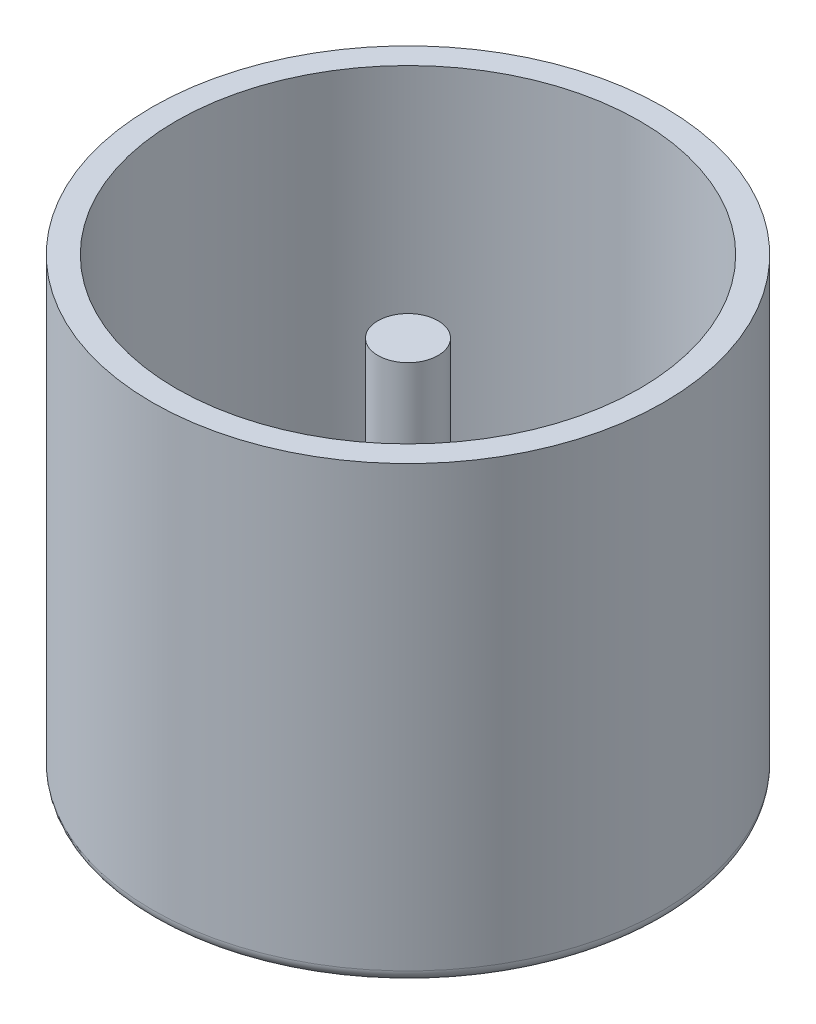
ISO-10303-21;
HEADER;
FILE_DESCRIPTION(('STEP AP214'),'2;1');
FILE_NAME('part.step','',(''),(''),'','','');
FILE_SCHEMA(('AUTOMOTIVE_DESIGN { 1 0 10303 214 1 1 1 1 }'));
ENDSEC;
DATA;
#1=APPLICATION_CONTEXT('core data for automotive mechanical design processes');
#2=APPLICATION_PROTOCOL_DEFINITION('international standard','automotive_design',2000,#1);
#3=PRODUCT_CONTEXT('',#1,'mechanical');
#4=PRODUCT('Part','Part','',(#3));
#5=PRODUCT_RELATED_PRODUCT_CATEGORY('part','',(#4));
#6=PRODUCT_DEFINITION_FORMATION('','',#4);
#7=PRODUCT_DEFINITION_CONTEXT('part definition',#1,'design');
#8=PRODUCT_DEFINITION('design','',#6,#7);
#9=PRODUCT_DEFINITION_SHAPE('','',#8);
#10=(LENGTH_UNIT() NAMED_UNIT(*) SI_UNIT(.MILLI.,.METRE.));
#11=(NAMED_UNIT(*) PLANE_ANGLE_UNIT() SI_UNIT($,.RADIAN.));
#12=(NAMED_UNIT(*) SI_UNIT($,.STERADIAN.) SOLID_ANGLE_UNIT());
#13=UNCERTAINTY_MEASURE_WITH_UNIT(LENGTH_MEASURE(1.E-05),#10,'distance_accuracy_value','');
#14=(GEOMETRIC_REPRESENTATION_CONTEXT(3) GLOBAL_UNCERTAINTY_ASSIGNED_CONTEXT((#13)) GLOBAL_UNIT_ASSIGNED_CONTEXT((#10,
#11,#12)) REPRESENTATION_CONTEXT('',''));
#15=CARTESIAN_POINT('',(0.,0.,0.));
#16=DIRECTION('',(0.,0.,1.));
#17=DIRECTION('',(1.,0.,0.));
#18=AXIS2_PLACEMENT_3D('',#15,#16,#17);
#19=CARTESIAN_POINT('',(0.,95.25,0.));
#20=DIRECTION('',(0.,-1.,0.));
#21=DIRECTION('',(0.,0.,-1.));
#22=AXIS2_PLACEMENT_3D('',#19,#20,#21);
#23=CYLINDRICAL_SURFACE('',#22,53.975);
#24=CARTESIAN_POINT('',(0.,2.54,0.));
#25=DIRECTION('',(0.,1.,0.));
#26=DIRECTION('',(0.,0.,1.));
#27=AXIS2_PLACEMENT_3D('',#24,#25,#26);
#28=CIRCLE('',#27,53.975);
#29=CARTESIAN_POINT('',(0.,2.54,53.975));
#30=VERTEX_POINT('',#29);
#31=EDGE_CURVE('E38',#30,#30,#28,.T.);
#32=ORIENTED_EDGE('',*,*,#31,.T.);
#33=EDGE_LOOP('',(#32));
#34=FACE_BOUND('',#33,.T.);
#35=CARTESIAN_POINT('',(0.,95.25,0.));
#36=DIRECTION('',(0.,1.,0.));
#37=DIRECTION('',(0.,0.,1.));
#38=AXIS2_PLACEMENT_3D('',#35,#36,#37);
#39=CIRCLE('',#38,53.975);
#40=CARTESIAN_POINT('',(0.,95.25,53.975));
#41=VERTEX_POINT('',#40);
#42=EDGE_CURVE('E42',#41,#41,#39,.T.);
#43=ORIENTED_EDGE('',*,*,#42,.F.);
#44=EDGE_LOOP('',(#43));
#45=FACE_BOUND('',#44,.T.);
#46=ADVANCED_FACE('F31',(#34,#45),#23,.T.);
#47=CARTESIAN_POINT('',(0.,95.25,0.));
#48=DIRECTION('',(0.,1.,0.));
#49=DIRECTION('',(0.,0.,1.));
#50=AXIS2_PLACEMENT_3D('',#47,#48,#49);
#51=PLANE('',#50);
#52=CARTESIAN_POINT('',(0.,95.25,0.));
#53=DIRECTION('',(0.,1.,0.));
#54=DIRECTION('',(0.,0.,1.));
#55=AXIS2_PLACEMENT_3D('',#52,#53,#54);
#56=CIRCLE('',#55,48.895);
#57=CARTESIAN_POINT('',(0.,95.25,48.895));
#58=VERTEX_POINT('',#57);
#59=EDGE_CURVE('E46',#58,#58,#56,.T.);
#60=ORIENTED_EDGE('',*,*,#59,.F.);
#61=EDGE_LOOP('',(#60));
#62=FACE_BOUND('',#61,.T.);
#63=ORIENTED_EDGE('',*,*,#42,.T.);
#64=EDGE_LOOP('',(#63));
#65=FACE_BOUND('',#64,.T.);
#66=ADVANCED_FACE('F83',(#62,#65),#51,.T.);
#67=CARTESIAN_POINT('',(0.,0.,0.));
#68=DIRECTION('',(0.,1.,0.));
#69=DIRECTION('',(0.,0.,1.));
#70=AXIS2_PLACEMENT_3D('',#67,#68,#69);
#71=PLANE('',#70);
#72=CARTESIAN_POINT('',(0.,0.,0.));
#73=DIRECTION('',(0.,1.,0.));
#74=DIRECTION('',(0.,0.,1.));
#75=AXIS2_PLACEMENT_3D('',#72,#73,#74);
#76=CIRCLE('',#75,51.435);
#77=CARTESIAN_POINT('',(0.,0.,51.435));
#78=VERTEX_POINT('',#77);
#79=EDGE_CURVE('E10',#78,#78,#76,.F.);
#80=ORIENTED_EDGE('',*,*,#79,.T.);
#81=EDGE_LOOP('',(#80));
#82=FACE_BOUND('',#81,.T.);
#83=ADVANCED_FACE('F77',(#82),#71,.F.);
#84=CARTESIAN_POINT('',(0.,95.25,0.));
#85=DIRECTION('',(0.,-1.,0.));
#86=DIRECTION('',(0.,0.,-1.));
#87=AXIS2_PLACEMENT_3D('',#84,#85,#86);
#88=CYLINDRICAL_SURFACE('',#87,48.895);
#89=ORIENTED_EDGE('',*,*,#59,.T.);
#90=EDGE_LOOP('',(#89));
#91=FACE_BOUND('',#90,.T.);
#92=CARTESIAN_POINT('',(0.,5.08,0.));
#93=DIRECTION('',(0.,1.,0.));
#94=DIRECTION('',(0.,0.,1.));
#95=AXIS2_PLACEMENT_3D('',#92,#93,#94);
#96=CIRCLE('',#95,48.895);
#97=CARTESIAN_POINT('',(0.,5.08,48.895));
#98=VERTEX_POINT('',#97);
#99=EDGE_CURVE('E51',#98,#98,#96,.T.);
#100=ORIENTED_EDGE('',*,*,#99,.F.);
#101=EDGE_LOOP('',(#100));
#102=FACE_BOUND('',#101,.T.);
#103=ADVANCED_FACE('F72',(#91,#102),#88,.F.);
#104=CARTESIAN_POINT('',(0.,5.08,0.));
#105=DIRECTION('',(0.,1.,0.));
#106=DIRECTION('',(0.,0.,1.));
#107=AXIS2_PLACEMENT_3D('',#104,#105,#106);
#108=PLANE('',#107);
#109=CARTESIAN_POINT('',(0.,5.08,0.));
#110=DIRECTION('',(0.,1.,0.));
#111=DIRECTION('',(0.,0.,1.));
#112=AXIS2_PLACEMENT_3D('',#109,#110,#111);
#113=CIRCLE('',#112,6.35);
#114=CARTESIAN_POINT('',(0.,5.08,6.35));
#115=VERTEX_POINT('',#114);
#116=EDGE_CURVE('E55',#115,#115,#113,.T.);
#117=ORIENTED_EDGE('',*,*,#116,.F.);
#118=EDGE_LOOP('',(#117));
#119=FACE_BOUND('',#118,.T.);
#120=ORIENTED_EDGE('',*,*,#99,.T.);
#121=EDGE_LOOP('',(#120));
#122=FACE_BOUND('',#121,.T.);
#123=ADVANCED_FACE('F66',(#119,#122),#108,.T.);
#124=CARTESIAN_POINT('',(0.,80.01,0.));
#125=DIRECTION('',(0.,-1.,0.));
#126=DIRECTION('',(0.,0.,-1.));
#127=AXIS2_PLACEMENT_3D('',#124,#125,#126);
#128=CYLINDRICAL_SURFACE('',#127,6.35);
#129=CARTESIAN_POINT('',(0.,80.01,0.));
#130=DIRECTION('',(0.,1.,0.));
#131=DIRECTION('',(0.,0.,1.));
#132=AXIS2_PLACEMENT_3D('',#129,#130,#131);
#133=CIRCLE('',#132,6.35);
#134=CARTESIAN_POINT('',(0.,80.01,6.35));
#135=VERTEX_POINT('',#134);
#136=EDGE_CURVE('E54',#135,#135,#133,.T.);
#137=ORIENTED_EDGE('',*,*,#136,.F.);
#138=EDGE_LOOP('',(#137));
#139=FACE_BOUND('',#138,.T.);
#140=ORIENTED_EDGE('',*,*,#116,.T.);
#141=EDGE_LOOP('',(#140));
#142=FACE_BOUND('',#141,.T.);
#143=ADVANCED_FACE('F63',(#139,#142),#128,.T.);
#144=CARTESIAN_POINT('',(0.,80.01,0.));
#145=DIRECTION('',(0.,1.,0.));
#146=DIRECTION('',(0.,0.,1.));
#147=AXIS2_PLACEMENT_3D('',#144,#145,#146);
#148=PLANE('',#147);
#149=ORIENTED_EDGE('',*,*,#136,.T.);
#150=EDGE_LOOP('',(#149));
#151=FACE_BOUND('',#150,.T.);
#152=ADVANCED_FACE('F61',(#151),#148,.T.);
#153=CARTESIAN_POINT('',(0.,2.54,0.));
#154=DIRECTION('',(0.,1.,0.));
#155=DIRECTION('',(0.,0.,1.));
#156=AXIS2_PLACEMENT_3D('',#153,#154,#155);
#157=TOROIDAL_SURFACE('',#156,51.435,2.54);
#158=ORIENTED_EDGE('',*,*,#79,.F.);
#159=EDGE_LOOP('',(#158));
#160=FACE_BOUND('',#159,.T.);
#161=ORIENTED_EDGE('',*,*,#31,.F.);
#162=EDGE_LOOP('',(#161));
#163=FACE_BOUND('',#162,.T.);
#164=ADVANCED_FACE('F33',(#160,#163),#157,.T.);
#165=CLOSED_SHELL('',(#46,#66,#83,#103,#123,#143,#152,#164));
#166=MANIFOLD_SOLID_BREP('B2',#165);
#167=ADVANCED_BREP_SHAPE_REPRESENTATION('',(#18,#166),#14);
#168=SHAPE_DEFINITION_REPRESENTATION(#9,#167);
ENDSEC;
END-ISO-10303-21;
